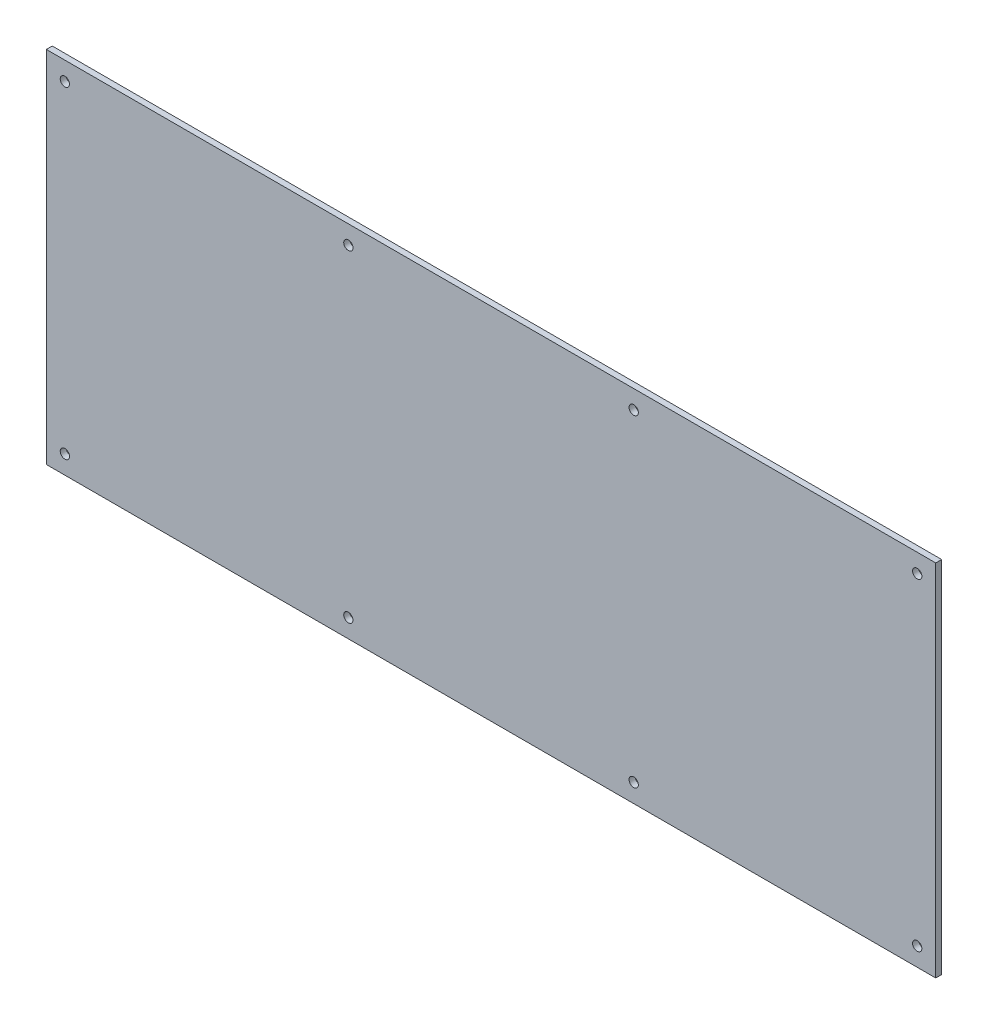
ISO-10303-21;
HEADER;
FILE_DESCRIPTION(('STEP AP214'),'2;1');
FILE_NAME('part.step','',(''),(''),'','','');
FILE_SCHEMA(('AUTOMOTIVE_DESIGN { 1 0 10303 214 1 1 1 1 }'));
ENDSEC;
DATA;
#1=APPLICATION_CONTEXT('core data for automotive mechanical design processes');
#2=APPLICATION_PROTOCOL_DEFINITION('international standard','automotive_design',2000,#1);
#3=PRODUCT_CONTEXT('',#1,'mechanical');
#4=PRODUCT('Part','Part','',(#3));
#5=PRODUCT_RELATED_PRODUCT_CATEGORY('part','',(#4));
#6=PRODUCT_DEFINITION_FORMATION('','',#4);
#7=PRODUCT_DEFINITION_CONTEXT('part definition',#1,'design');
#8=PRODUCT_DEFINITION('design','',#6,#7);
#9=PRODUCT_DEFINITION_SHAPE('','',#8);
#10=(LENGTH_UNIT() NAMED_UNIT(*) SI_UNIT(.MILLI.,.METRE.));
#11=(NAMED_UNIT(*) PLANE_ANGLE_UNIT() SI_UNIT($,.RADIAN.));
#12=(NAMED_UNIT(*) SI_UNIT($,.STERADIAN.) SOLID_ANGLE_UNIT());
#13=UNCERTAINTY_MEASURE_WITH_UNIT(LENGTH_MEASURE(1.E-05),#10,'distance_accuracy_value','');
#14=(GEOMETRIC_REPRESENTATION_CONTEXT(3) GLOBAL_UNCERTAINTY_ASSIGNED_CONTEXT((#13)) GLOBAL_UNIT_ASSIGNED_CONTEXT((#10,
#11,#12)) REPRESENTATION_CONTEXT('',''));
#15=CARTESIAN_POINT('',(0.,0.,0.));
#16=DIRECTION('',(0.,0.,1.));
#17=DIRECTION('',(1.,0.,0.));
#18=AXIS2_PLACEMENT_3D('',#15,#16,#17);
#19=CARTESIAN_POINT('',(0.,123.19,2.032));
#20=DIRECTION('',(1.,0.,0.));
#21=DIRECTION('',(0.,1.,0.));
#22=AXIS2_PLACEMENT_3D('',#19,#20,#21);
#23=PLANE('',#22);
#24=DIRECTION('',(0.,-1.,0.));
#25=VECTOR('',#24,1.);
#26=CARTESIAN_POINT('',(0.,123.19,0.));
#27=LINE('',#26,#25);
#28=CARTESIAN_POINT('',(0.,123.19,0.));
#29=VERTEX_POINT('',#28);
#30=CARTESIAN_POINT('',(0.,0.,0.));
#31=VERTEX_POINT('',#30);
#32=EDGE_CURVE('E96',#29,#31,#27,.T.);
#33=ORIENTED_EDGE('',*,*,#32,.T.);
#34=DIRECTION('',(0.,0.,-1.));
#35=VECTOR('',#34,1.);
#36=CARTESIAN_POINT('',(0.,0.,2.032));
#37=LINE('',#36,#35);
#38=CARTESIAN_POINT('',(0.,0.,2.032));
#39=VERTEX_POINT('',#38);
#40=EDGE_CURVE('E11',#39,#31,#37,.T.);
#41=ORIENTED_EDGE('',*,*,#40,.F.);
#42=DIRECTION('',(0.,-1.,0.));
#43=VECTOR('',#42,1.);
#44=CARTESIAN_POINT('',(0.,123.19,2.032));
#45=LINE('',#44,#43);
#46=CARTESIAN_POINT('',(0.,123.19,2.032));
#47=VERTEX_POINT('',#46);
#48=EDGE_CURVE('E84',#47,#39,#45,.T.);
#49=ORIENTED_EDGE('',*,*,#48,.F.);
#50=DIRECTION('',(0.,0.,-1.));
#51=VECTOR('',#50,1.);
#52=CARTESIAN_POINT('',(0.,123.19,2.032));
#53=LINE('',#52,#51);
#54=EDGE_CURVE('E92',#47,#29,#53,.T.);
#55=ORIENTED_EDGE('',*,*,#54,.T.);
#56=EDGE_LOOP('',(#33,#41,#49,#55));
#57=FACE_BOUND('',#56,.T.);
#58=ADVANCED_FACE('F33',(#57),#23,.F.);
#59=CARTESIAN_POINT('',(0.,0.,2.032));
#60=DIRECTION('',(0.,1.,0.));
#61=DIRECTION('',(0.,0.,1.));
#62=AXIS2_PLACEMENT_3D('',#59,#60,#61);
#63=PLANE('',#62);
#64=DIRECTION('',(1.,0.,0.));
#65=VECTOR('',#64,1.);
#66=CARTESIAN_POINT('',(0.,0.,0.));
#67=LINE('',#66,#65);
#68=CARTESIAN_POINT('',(304.8,0.,0.));
#69=VERTEX_POINT('',#68);
#70=EDGE_CURVE('E88',#31,#69,#67,.T.);
#71=ORIENTED_EDGE('',*,*,#70,.T.);
#72=DIRECTION('',(0.,0.,-1.));
#73=VECTOR('',#72,1.);
#74=CARTESIAN_POINT('',(304.8,0.,2.032));
#75=LINE('',#74,#73);
#76=CARTESIAN_POINT('',(304.8,0.,2.032));
#77=VERTEX_POINT('',#76);
#78=EDGE_CURVE('E41',#77,#69,#75,.T.);
#79=ORIENTED_EDGE('',*,*,#78,.F.);
#80=DIRECTION('',(1.,0.,0.));
#81=VECTOR('',#80,1.);
#82=CARTESIAN_POINT('',(0.,0.,2.032));
#83=LINE('',#82,#81);
#84=EDGE_CURVE('E79',#39,#77,#83,.T.);
#85=ORIENTED_EDGE('',*,*,#84,.F.);
#86=ORIENTED_EDGE('',*,*,#40,.T.);
#87=EDGE_LOOP('',(#71,#79,#85,#86));
#88=FACE_BOUND('',#87,.T.);
#89=ADVANCED_FACE('F87',(#88),#63,.F.);
#90=CARTESIAN_POINT('',(304.8,123.19,2.032));
#91=DIRECTION('',(-1.,0.,0.));
#92=DIRECTION('',(0.,0.,1.));
#93=AXIS2_PLACEMENT_3D('',#90,#91,#92);
#94=PLANE('',#93);
#95=DIRECTION('',(0.,1.,0.));
#96=VECTOR('',#95,1.);
#97=CARTESIAN_POINT('',(304.8,123.19,0.));
#98=LINE('',#97,#96);
#99=CARTESIAN_POINT('',(304.8,123.19,0.));
#100=VERTEX_POINT('',#99);
#101=EDGE_CURVE('E66',#69,#100,#98,.T.);
#102=ORIENTED_EDGE('',*,*,#101,.T.);
#103=DIRECTION('',(0.,0.,-1.));
#104=VECTOR('',#103,1.);
#105=CARTESIAN_POINT('',(304.8,123.19,2.032));
#106=LINE('',#105,#104);
#107=CARTESIAN_POINT('',(304.8,123.19,2.032));
#108=VERTEX_POINT('',#107);
#109=EDGE_CURVE('E89',#108,#100,#106,.T.);
#110=ORIENTED_EDGE('',*,*,#109,.F.);
#111=DIRECTION('',(0.,1.,0.));
#112=VECTOR('',#111,1.);
#113=CARTESIAN_POINT('',(304.8,123.19,2.032));
#114=LINE('',#113,#112);
#115=EDGE_CURVE('E82',#77,#108,#114,.T.);
#116=ORIENTED_EDGE('',*,*,#115,.F.);
#117=ORIENTED_EDGE('',*,*,#78,.T.);
#118=EDGE_LOOP('',(#102,#110,#116,#117));
#119=FACE_BOUND('',#118,.T.);
#120=ADVANCED_FACE('F90',(#119),#94,.F.);
#121=CARTESIAN_POINT('',(0.,123.19,2.032));
#122=DIRECTION('',(0.,-1.,0.));
#123=DIRECTION('',(0.,0.,-1.));
#124=AXIS2_PLACEMENT_3D('',#121,#122,#123);
#125=PLANE('',#124);
#126=DIRECTION('',(-1.,0.,0.));
#127=VECTOR('',#126,1.);
#128=CARTESIAN_POINT('',(0.,123.19,0.));
#129=LINE('',#128,#127);
#130=EDGE_CURVE('E72',#100,#29,#129,.T.);
#131=ORIENTED_EDGE('',*,*,#130,.T.);
#132=ORIENTED_EDGE('',*,*,#54,.F.);
#133=DIRECTION('',(-1.,0.,0.));
#134=VECTOR('',#133,1.);
#135=CARTESIAN_POINT('',(0.,123.19,2.032));
#136=LINE('',#135,#134);
#137=EDGE_CURVE('E49',#108,#47,#136,.T.);
#138=ORIENTED_EDGE('',*,*,#137,.F.);
#139=ORIENTED_EDGE('',*,*,#109,.T.);
#140=EDGE_LOOP('',(#131,#132,#138,#139));
#141=FACE_BOUND('',#140,.T.);
#142=ADVANCED_FACE('F104',(#141),#125,.F.);
#143=CARTESIAN_POINT('',(0.,0.,2.032));
#144=DIRECTION('',(0.,0.,1.));
#145=DIRECTION('',(1.,0.,0.));
#146=AXIS2_PLACEMENT_3D('',#143,#144,#145);
#147=PLANE('',#146);
#148=CARTESIAN_POINT('',(298.45,116.84,2.032));
#149=DIRECTION('',(0.,0.,1.));
#150=DIRECTION('',(-1.,0.,0.));
#151=AXIS2_PLACEMENT_3D('',#148,#149,#150);
#152=CIRCLE('',#151,1.58750000000004);
#153=CARTESIAN_POINT('',(296.8625,116.84,2.032));
#154=VERTEX_POINT('',#153);
#155=EDGE_CURVE('E152',#154,#154,#152,.T.);
#156=ORIENTED_EDGE('',*,*,#155,.F.);
#157=EDGE_LOOP('',(#156));
#158=FACE_BOUND('',#157,.T.);
#159=CARTESIAN_POINT('',(298.45,6.35000000000004,2.032));
#160=DIRECTION('',(0.,0.,1.));
#161=DIRECTION('',(-1.,0.,0.));
#162=AXIS2_PLACEMENT_3D('',#159,#160,#161);
#163=CIRCLE('',#162,1.58750000000004);
#164=CARTESIAN_POINT('',(296.8625,6.35000000000004,2.032));
#165=VERTEX_POINT('',#164);
#166=EDGE_CURVE('E146',#165,#165,#163,.T.);
#167=ORIENTED_EDGE('',*,*,#166,.F.);
#168=EDGE_LOOP('',(#167));
#169=FACE_BOUND('',#168,.T.);
#170=CARTESIAN_POINT('',(201.295,6.34999999999883,2.032));
#171=DIRECTION('',(0.,0.,1.));
#172=DIRECTION('',(-1.,0.,0.));
#173=AXIS2_PLACEMENT_3D('',#170,#171,#172);
#174=CIRCLE('',#173,1.58750000000001);
#175=CARTESIAN_POINT('',(199.7075,6.34999999999883,2.032));
#176=VERTEX_POINT('',#175);
#177=EDGE_CURVE('E140',#176,#176,#174,.T.);
#178=ORIENTED_EDGE('',*,*,#177,.F.);
#179=EDGE_LOOP('',(#178));
#180=FACE_BOUND('',#179,.T.);
#181=CARTESIAN_POINT('',(201.295,116.84,2.032));
#182=DIRECTION('',(0.,0.,1.));
#183=DIRECTION('',(-1.,0.,0.));
#184=AXIS2_PLACEMENT_3D('',#181,#182,#183);
#185=CIRCLE('',#184,1.58750000000002);
#186=CARTESIAN_POINT('',(199.7075,116.84,2.032));
#187=VERTEX_POINT('',#186);
#188=EDGE_CURVE('E134',#187,#187,#185,.T.);
#189=ORIENTED_EDGE('',*,*,#188,.F.);
#190=EDGE_LOOP('',(#189));
#191=FACE_BOUND('',#190,.T.);
#192=CARTESIAN_POINT('',(103.505,116.84,2.032));
#193=DIRECTION('',(0.,0.,1.));
#194=DIRECTION('',(1.,0.,0.));
#195=AXIS2_PLACEMENT_3D('',#192,#193,#194);
#196=CIRCLE('',#195,1.58750000000002);
#197=CARTESIAN_POINT('',(105.0925,116.84,2.032));
#198=VERTEX_POINT('',#197);
#199=EDGE_CURVE('E128',#198,#198,#196,.T.);
#200=ORIENTED_EDGE('',*,*,#199,.F.);
#201=EDGE_LOOP('',(#200));
#202=FACE_BOUND('',#201,.T.);
#203=CARTESIAN_POINT('',(103.505,6.34999999999876,2.032));
#204=DIRECTION('',(0.,0.,1.));
#205=DIRECTION('',(1.,0.,0.));
#206=AXIS2_PLACEMENT_3D('',#203,#204,#205);
#207=CIRCLE('',#206,1.58750000000002);
#208=CARTESIAN_POINT('',(105.0925,6.34999999999876,2.032));
#209=VERTEX_POINT('',#208);
#210=EDGE_CURVE('E122',#209,#209,#207,.T.);
#211=ORIENTED_EDGE('',*,*,#210,.F.);
#212=EDGE_LOOP('',(#211));
#213=FACE_BOUND('',#212,.T.);
#214=CARTESIAN_POINT('',(6.34999999999997,6.34999999999995,2.032));
#215=DIRECTION('',(0.,0.,1.));
#216=DIRECTION('',(1.,0.,0.));
#217=AXIS2_PLACEMENT_3D('',#214,#215,#216);
#218=CIRCLE('',#217,1.58749999999995);
#219=CARTESIAN_POINT('',(7.93749999999992,6.34999999999995,2.032));
#220=VERTEX_POINT('',#219);
#221=EDGE_CURVE('E116',#220,#220,#218,.T.);
#222=ORIENTED_EDGE('',*,*,#221,.F.);
#223=EDGE_LOOP('',(#222));
#224=FACE_BOUND('',#223,.T.);
#225=CARTESIAN_POINT('',(6.34999999999997,116.84,2.032));
#226=DIRECTION('',(0.,0.,1.));
#227=DIRECTION('',(1.,0.,0.));
#228=AXIS2_PLACEMENT_3D('',#225,#226,#227);
#229=CIRCLE('',#228,1.58750000000003);
#230=CARTESIAN_POINT('',(7.93749999999999,116.84,2.032));
#231=VERTEX_POINT('',#230);
#232=EDGE_CURVE('E110',#231,#231,#229,.T.);
#233=ORIENTED_EDGE('',*,*,#232,.F.);
#234=EDGE_LOOP('',(#233));
#235=FACE_BOUND('',#234,.T.);
#236=ORIENTED_EDGE('',*,*,#48,.T.);
#237=ORIENTED_EDGE('',*,*,#84,.T.);
#238=ORIENTED_EDGE('',*,*,#115,.T.);
#239=ORIENTED_EDGE('',*,*,#137,.T.);
#240=EDGE_LOOP('',(#236,#237,#238,#239));
#241=FACE_BOUND('',#240,.T.);
#242=ADVANCED_FACE('F80',(#158,#169,#180,#191,#202,#213,#224,#235,#241),#147,.T.);
#243=CARTESIAN_POINT('',(0.,0.,0.));
#244=DIRECTION('',(0.,0.,1.));
#245=DIRECTION('',(1.,0.,0.));
#246=AXIS2_PLACEMENT_3D('',#243,#244,#245);
#247=PLANE('',#246);
#248=CARTESIAN_POINT('',(298.45,116.84,0.));
#249=DIRECTION('',(0.,0.,1.));
#250=DIRECTION('',(-1.,0.,0.));
#251=AXIS2_PLACEMENT_3D('',#248,#249,#250);
#252=CIRCLE('',#251,1.58750000000004);
#253=CARTESIAN_POINT('',(296.8625,116.84,0.));
#254=VERTEX_POINT('',#253);
#255=EDGE_CURVE('E149',#254,#254,#252,.T.);
#256=ORIENTED_EDGE('',*,*,#255,.T.);
#257=EDGE_LOOP('',(#256));
#258=FACE_BOUND('',#257,.T.);
#259=CARTESIAN_POINT('',(298.45,6.35000000000004,0.));
#260=DIRECTION('',(0.,0.,1.));
#261=DIRECTION('',(-1.,0.,0.));
#262=AXIS2_PLACEMENT_3D('',#259,#260,#261);
#263=CIRCLE('',#262,1.58750000000004);
#264=CARTESIAN_POINT('',(296.8625,6.35000000000004,0.));
#265=VERTEX_POINT('',#264);
#266=EDGE_CURVE('E143',#265,#265,#263,.T.);
#267=ORIENTED_EDGE('',*,*,#266,.T.);
#268=EDGE_LOOP('',(#267));
#269=FACE_BOUND('',#268,.T.);
#270=CARTESIAN_POINT('',(201.295,6.34999999999883,0.));
#271=DIRECTION('',(0.,0.,1.));
#272=DIRECTION('',(-1.,0.,0.));
#273=AXIS2_PLACEMENT_3D('',#270,#271,#272);
#274=CIRCLE('',#273,1.58750000000001);
#275=CARTESIAN_POINT('',(199.7075,6.34999999999883,0.));
#276=VERTEX_POINT('',#275);
#277=EDGE_CURVE('E137',#276,#276,#274,.T.);
#278=ORIENTED_EDGE('',*,*,#277,.T.);
#279=EDGE_LOOP('',(#278));
#280=FACE_BOUND('',#279,.T.);
#281=CARTESIAN_POINT('',(201.295,116.84,0.));
#282=DIRECTION('',(0.,0.,1.));
#283=DIRECTION('',(-1.,0.,0.));
#284=AXIS2_PLACEMENT_3D('',#281,#282,#283);
#285=CIRCLE('',#284,1.58750000000002);
#286=CARTESIAN_POINT('',(199.7075,116.84,0.));
#287=VERTEX_POINT('',#286);
#288=EDGE_CURVE('E131',#287,#287,#285,.T.);
#289=ORIENTED_EDGE('',*,*,#288,.T.);
#290=EDGE_LOOP('',(#289));
#291=FACE_BOUND('',#290,.T.);
#292=CARTESIAN_POINT('',(103.505,116.84,0.));
#293=DIRECTION('',(0.,0.,1.));
#294=DIRECTION('',(1.,0.,0.));
#295=AXIS2_PLACEMENT_3D('',#292,#293,#294);
#296=CIRCLE('',#295,1.58750000000002);
#297=CARTESIAN_POINT('',(105.0925,116.84,0.));
#298=VERTEX_POINT('',#297);
#299=EDGE_CURVE('E125',#298,#298,#296,.T.);
#300=ORIENTED_EDGE('',*,*,#299,.T.);
#301=EDGE_LOOP('',(#300));
#302=FACE_BOUND('',#301,.T.);
#303=CARTESIAN_POINT('',(103.505,6.34999999999876,0.));
#304=DIRECTION('',(0.,0.,1.));
#305=DIRECTION('',(1.,0.,0.));
#306=AXIS2_PLACEMENT_3D('',#303,#304,#305);
#307=CIRCLE('',#306,1.58750000000002);
#308=CARTESIAN_POINT('',(105.0925,6.34999999999876,0.));
#309=VERTEX_POINT('',#308);
#310=EDGE_CURVE('E119',#309,#309,#307,.T.);
#311=ORIENTED_EDGE('',*,*,#310,.T.);
#312=EDGE_LOOP('',(#311));
#313=FACE_BOUND('',#312,.T.);
#314=CARTESIAN_POINT('',(6.34999999999997,6.34999999999995,0.));
#315=DIRECTION('',(0.,0.,1.));
#316=DIRECTION('',(1.,0.,0.));
#317=AXIS2_PLACEMENT_3D('',#314,#315,#316);
#318=CIRCLE('',#317,1.58749999999995);
#319=CARTESIAN_POINT('',(7.93749999999992,6.34999999999995,0.));
#320=VERTEX_POINT('',#319);
#321=EDGE_CURVE('E113',#320,#320,#318,.T.);
#322=ORIENTED_EDGE('',*,*,#321,.T.);
#323=EDGE_LOOP('',(#322));
#324=FACE_BOUND('',#323,.T.);
#325=CARTESIAN_POINT('',(6.34999999999997,116.84,0.));
#326=DIRECTION('',(0.,0.,1.));
#327=DIRECTION('',(1.,0.,0.));
#328=AXIS2_PLACEMENT_3D('',#325,#326,#327);
#329=CIRCLE('',#328,1.58750000000003);
#330=CARTESIAN_POINT('',(7.93749999999999,116.84,0.));
#331=VERTEX_POINT('',#330);
#332=EDGE_CURVE('E99',#331,#331,#329,.T.);
#333=ORIENTED_EDGE('',*,*,#332,.T.);
#334=EDGE_LOOP('',(#333));
#335=FACE_BOUND('',#334,.T.);
#336=ORIENTED_EDGE('',*,*,#32,.F.);
#337=ORIENTED_EDGE('',*,*,#130,.F.);
#338=ORIENTED_EDGE('',*,*,#101,.F.);
#339=ORIENTED_EDGE('',*,*,#70,.F.);
#340=EDGE_LOOP('',(#336,#337,#338,#339));
#341=FACE_BOUND('',#340,.T.);
#342=ADVANCED_FACE('F107',(#258,#269,#280,#291,#302,#313,#324,#335,#341),#247,.F.);
#343=CARTESIAN_POINT('',(6.34999999999997,116.84,0.));
#344=DIRECTION('',(0.,0.,1.));
#345=DIRECTION('',(1.,0.,0.));
#346=AXIS2_PLACEMENT_3D('',#343,#344,#345);
#347=CYLINDRICAL_SURFACE('',#346,1.58750000000003);
#348=ORIENTED_EDGE('',*,*,#332,.F.);
#349=EDGE_LOOP('',(#348));
#350=FACE_BOUND('',#349,.T.);
#351=ORIENTED_EDGE('',*,*,#232,.T.);
#352=EDGE_LOOP('',(#351));
#353=FACE_BOUND('',#352,.T.);
#354=ADVANCED_FACE('F184',(#350,#353),#347,.F.);
#355=CARTESIAN_POINT('',(6.34999999999997,6.34999999999995,0.));
#356=DIRECTION('',(0.,0.,1.));
#357=DIRECTION('',(1.,0.,0.));
#358=AXIS2_PLACEMENT_3D('',#355,#356,#357);
#359=CYLINDRICAL_SURFACE('',#358,1.58749999999995);
#360=ORIENTED_EDGE('',*,*,#321,.F.);
#361=EDGE_LOOP('',(#360));
#362=FACE_BOUND('',#361,.T.);
#363=ORIENTED_EDGE('',*,*,#221,.T.);
#364=EDGE_LOOP('',(#363));
#365=FACE_BOUND('',#364,.T.);
#366=ADVANCED_FACE('F186',(#362,#365),#359,.F.);
#367=CARTESIAN_POINT('',(103.505,6.34999999999876,0.));
#368=DIRECTION('',(0.,0.,1.));
#369=DIRECTION('',(1.,0.,0.));
#370=AXIS2_PLACEMENT_3D('',#367,#368,#369);
#371=CYLINDRICAL_SURFACE('',#370,1.58750000000002);
#372=ORIENTED_EDGE('',*,*,#310,.F.);
#373=EDGE_LOOP('',(#372));
#374=FACE_BOUND('',#373,.T.);
#375=ORIENTED_EDGE('',*,*,#210,.T.);
#376=EDGE_LOOP('',(#375));
#377=FACE_BOUND('',#376,.T.);
#378=ADVANCED_FACE('F193',(#374,#377),#371,.F.);
#379=CARTESIAN_POINT('',(103.505,116.84,0.));
#380=DIRECTION('',(0.,0.,1.));
#381=DIRECTION('',(1.,0.,0.));
#382=AXIS2_PLACEMENT_3D('',#379,#380,#381);
#383=CYLINDRICAL_SURFACE('',#382,1.58750000000002);
#384=ORIENTED_EDGE('',*,*,#299,.F.);
#385=EDGE_LOOP('',(#384));
#386=FACE_BOUND('',#385,.T.);
#387=ORIENTED_EDGE('',*,*,#199,.T.);
#388=EDGE_LOOP('',(#387));
#389=FACE_BOUND('',#388,.T.);
#390=ADVANCED_FACE('F239',(#386,#389),#383,.F.);
#391=CARTESIAN_POINT('',(201.295,116.84,0.));
#392=DIRECTION('',(0.,0.,1.));
#393=DIRECTION('',(1.,0.,0.));
#394=AXIS2_PLACEMENT_3D('',#391,#392,#393);
#395=CYLINDRICAL_SURFACE('',#394,1.58750000000002);
#396=ORIENTED_EDGE('',*,*,#288,.F.);
#397=EDGE_LOOP('',(#396));
#398=FACE_BOUND('',#397,.T.);
#399=ORIENTED_EDGE('',*,*,#188,.T.);
#400=EDGE_LOOP('',(#399));
#401=FACE_BOUND('',#400,.T.);
#402=ADVANCED_FACE('F249',(#398,#401),#395,.F.);
#403=CARTESIAN_POINT('',(201.295,6.34999999999883,0.));
#404=DIRECTION('',(0.,0.,1.));
#405=DIRECTION('',(1.,0.,0.));
#406=AXIS2_PLACEMENT_3D('',#403,#404,#405);
#407=CYLINDRICAL_SURFACE('',#406,1.58750000000001);
#408=ORIENTED_EDGE('',*,*,#277,.F.);
#409=EDGE_LOOP('',(#408));
#410=FACE_BOUND('',#409,.T.);
#411=ORIENTED_EDGE('',*,*,#177,.T.);
#412=EDGE_LOOP('',(#411));
#413=FACE_BOUND('',#412,.T.);
#414=ADVANCED_FACE('F259',(#410,#413),#407,.F.);
#415=CARTESIAN_POINT('',(298.45,6.35000000000004,0.));
#416=DIRECTION('',(0.,0.,1.));
#417=DIRECTION('',(1.,0.,0.));
#418=AXIS2_PLACEMENT_3D('',#415,#416,#417);
#419=CYLINDRICAL_SURFACE('',#418,1.58750000000004);
#420=ORIENTED_EDGE('',*,*,#266,.F.);
#421=EDGE_LOOP('',(#420));
#422=FACE_BOUND('',#421,.T.);
#423=ORIENTED_EDGE('',*,*,#166,.T.);
#424=EDGE_LOOP('',(#423));
#425=FACE_BOUND('',#424,.T.);
#426=ADVANCED_FACE('F163',(#422,#425),#419,.F.);
#427=CARTESIAN_POINT('',(298.45,116.84,0.));
#428=DIRECTION('',(0.,0.,1.));
#429=DIRECTION('',(1.,0.,0.));
#430=AXIS2_PLACEMENT_3D('',#427,#428,#429);
#431=CYLINDRICAL_SURFACE('',#430,1.58750000000004);
#432=ORIENTED_EDGE('',*,*,#255,.F.);
#433=EDGE_LOOP('',(#432));
#434=FACE_BOUND('',#433,.T.);
#435=ORIENTED_EDGE('',*,*,#155,.T.);
#436=EDGE_LOOP('',(#435));
#437=FACE_BOUND('',#436,.T.);
#438=ADVANCED_FACE('F160',(#434,#437),#431,.F.);
#439=CLOSED_SHELL('',(#58,#89,#120,#142,#242,#342,#354,#366,#378,#390,#402,#414,#426,#438));
#440=MANIFOLD_SOLID_BREP('B2',#439);
#441=ADVANCED_BREP_SHAPE_REPRESENTATION('',(#18,#440),#14);
#442=SHAPE_DEFINITION_REPRESENTATION(#9,#441);
ENDSEC;
END-ISO-10303-21;
